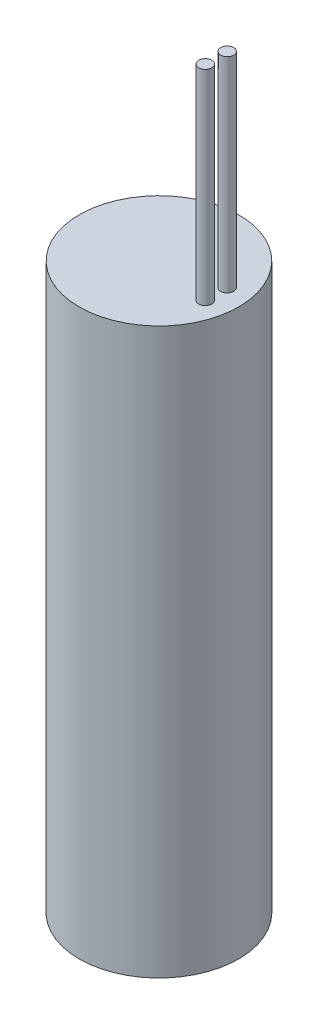
ISO-10303-21;
HEADER;
FILE_DESCRIPTION(('STEP AP214'),'2;1');
FILE_NAME('part.step','',(''),(''),'','','');
FILE_SCHEMA(('AUTOMOTIVE_DESIGN { 1 0 10303 214 1 1 1 1 }'));
ENDSEC;
DATA;
#1=APPLICATION_CONTEXT('core data for automotive mechanical design processes');
#2=APPLICATION_PROTOCOL_DEFINITION('international standard','automotive_design',2000,#1);
#3=PRODUCT_CONTEXT('',#1,'mechanical');
#4=PRODUCT('Part','Part','',(#3));
#5=PRODUCT_RELATED_PRODUCT_CATEGORY('part','',(#4));
#6=PRODUCT_DEFINITION_FORMATION('','',#4);
#7=PRODUCT_DEFINITION_CONTEXT('part definition',#1,'design');
#8=PRODUCT_DEFINITION('design','',#6,#7);
#9=PRODUCT_DEFINITION_SHAPE('','',#8);
#10=(LENGTH_UNIT() NAMED_UNIT(*) SI_UNIT(.MILLI.,.METRE.));
#11=(NAMED_UNIT(*) PLANE_ANGLE_UNIT() SI_UNIT($,.RADIAN.));
#12=(NAMED_UNIT(*) SI_UNIT($,.STERADIAN.) SOLID_ANGLE_UNIT());
#13=UNCERTAINTY_MEASURE_WITH_UNIT(LENGTH_MEASURE(1.E-05),#10,'distance_accuracy_value','');
#14=(GEOMETRIC_REPRESENTATION_CONTEXT(3) GLOBAL_UNCERTAINTY_ASSIGNED_CONTEXT((#13)) GLOBAL_UNIT_ASSIGNED_CONTEXT((#10,
#11,#12)) REPRESENTATION_CONTEXT('',''));
#15=CARTESIAN_POINT('',(0.,0.,0.));
#16=DIRECTION('',(0.,0.,1.));
#17=DIRECTION('',(1.,0.,0.));
#18=AXIS2_PLACEMENT_3D('',#15,#16,#17);
#19=CARTESIAN_POINT('',(0.,69.,0.));
#20=DIRECTION('',(0.,-1.,0.));
#21=DIRECTION('',(0.,0.,-1.));
#22=AXIS2_PLACEMENT_3D('',#19,#20,#21);
#23=CYLINDRICAL_SURFACE('',#22,9.75);
#24=CARTESIAN_POINT('',(0.,69.,0.));
#25=DIRECTION('',(0.,1.,0.));
#26=DIRECTION('',(0.,0.,1.));
#27=AXIS2_PLACEMENT_3D('',#24,#25,#26);
#28=CIRCLE('',#27,9.75);
#29=CARTESIAN_POINT('',(0.,69.,9.75));
#30=VERTEX_POINT('',#29);
#31=EDGE_CURVE('E10',#30,#30,#28,.T.);
#32=ORIENTED_EDGE('',*,*,#31,.F.);
#33=EDGE_LOOP('',(#32));
#34=FACE_BOUND('',#33,.T.);
#35=CARTESIAN_POINT('',(0.,0.,0.));
#36=DIRECTION('',(0.,1.,0.));
#37=DIRECTION('',(0.,0.,1.));
#38=AXIS2_PLACEMENT_3D('',#35,#36,#37);
#39=CIRCLE('',#38,9.75);
#40=CARTESIAN_POINT('',(0.,0.,9.75));
#41=VERTEX_POINT('',#40);
#42=EDGE_CURVE('E44',#41,#41,#39,.T.);
#43=ORIENTED_EDGE('',*,*,#42,.T.);
#44=EDGE_LOOP('',(#43));
#45=FACE_BOUND('',#44,.T.);
#46=ADVANCED_FACE('F41',(#34,#45),#23,.T.);
#47=CARTESIAN_POINT('',(0.,69.,0.));
#48=DIRECTION('',(0.,1.,0.));
#49=DIRECTION('',(0.,0.,1.));
#50=AXIS2_PLACEMENT_3D('',#47,#48,#49);
#51=PLANE('',#50);
#52=CARTESIAN_POINT('',(7.,69.,-1.33799721632115));
#53=DIRECTION('',(0.,1.,0.));
#54=DIRECTION('',(0.,0.,1.));
#55=AXIS2_PLACEMENT_3D('',#52,#53,#54);
#56=CIRCLE('',#55,0.800000000000001);
#57=CARTESIAN_POINT('',(7.,69.,-0.537997216321145));
#58=VERTEX_POINT('',#57);
#59=EDGE_CURVE('E59',#58,#58,#56,.T.);
#60=ORIENTED_EDGE('',*,*,#59,.F.);
#61=EDGE_LOOP('',(#60));
#62=FACE_BOUND('',#61,.T.);
#63=CARTESIAN_POINT('',(7.,69.,1.33799721632115));
#64=DIRECTION('',(0.,1.,0.));
#65=DIRECTION('',(0.,0.,1.));
#66=AXIS2_PLACEMENT_3D('',#63,#64,#65);
#67=CIRCLE('',#66,0.800000000000001);
#68=CARTESIAN_POINT('',(7.,69.,2.13799721632115));
#69=VERTEX_POINT('',#68);
#70=EDGE_CURVE('E56',#69,#69,#67,.T.);
#71=ORIENTED_EDGE('',*,*,#70,.F.);
#72=EDGE_LOOP('',(#71));
#73=FACE_BOUND('',#72,.T.);
#74=ORIENTED_EDGE('',*,*,#31,.T.);
#75=EDGE_LOOP('',(#74));
#76=FACE_BOUND('',#75,.T.);
#77=ADVANCED_FACE('F74',(#62,#73,#76),#51,.T.);
#78=CARTESIAN_POINT('',(0.,0.,0.));
#79=DIRECTION('',(0.,1.,0.));
#80=DIRECTION('',(0.,0.,1.));
#81=AXIS2_PLACEMENT_3D('',#78,#79,#80);
#82=PLANE('',#81);
#83=ORIENTED_EDGE('',*,*,#42,.F.);
#84=EDGE_LOOP('',(#83));
#85=FACE_BOUND('',#84,.T.);
#86=ADVANCED_FACE('F77',(#85),#82,.F.);
#87=CARTESIAN_POINT('',(7.,94.,1.33799721632115));
#88=DIRECTION('',(0.,-1.,0.));
#89=DIRECTION('',(0.,0.,-1.));
#90=AXIS2_PLACEMENT_3D('',#87,#88,#89);
#91=CYLINDRICAL_SURFACE('',#90,0.800000000000001);
#92=CARTESIAN_POINT('',(7.,94.,1.33799721632115));
#93=DIRECTION('',(0.,1.,0.));
#94=DIRECTION('',(0.,0.,1.));
#95=AXIS2_PLACEMENT_3D('',#92,#93,#94);
#96=CIRCLE('',#95,0.800000000000001);
#97=CARTESIAN_POINT('',(7.,94.,2.13799721632115));
#98=VERTEX_POINT('',#97);
#99=EDGE_CURVE('E53',#98,#98,#96,.T.);
#100=ORIENTED_EDGE('',*,*,#99,.F.);
#101=EDGE_LOOP('',(#100));
#102=FACE_BOUND('',#101,.T.);
#103=ORIENTED_EDGE('',*,*,#70,.T.);
#104=EDGE_LOOP('',(#103));
#105=FACE_BOUND('',#104,.T.);
#106=ADVANCED_FACE('F81',(#102,#105),#91,.T.);
#107=CARTESIAN_POINT('',(7.,94.,1.33799721632115));
#108=DIRECTION('',(0.,1.,0.));
#109=DIRECTION('',(0.,0.,1.));
#110=AXIS2_PLACEMENT_3D('',#107,#108,#109);
#111=PLANE('',#110);
#112=ORIENTED_EDGE('',*,*,#99,.T.);
#113=EDGE_LOOP('',(#112));
#114=FACE_BOUND('',#113,.T.);
#115=ADVANCED_FACE('F70',(#114),#111,.T.);
#116=CARTESIAN_POINT('',(7.,94.,-1.33799721632115));
#117=DIRECTION('',(0.,-1.,0.));
#118=DIRECTION('',(0.,0.,-1.));
#119=AXIS2_PLACEMENT_3D('',#116,#117,#118);
#120=CYLINDRICAL_SURFACE('',#119,0.800000000000001);
#121=CARTESIAN_POINT('',(7.,94.,-1.33799721632115));
#122=DIRECTION('',(0.,1.,0.));
#123=DIRECTION('',(0.,0.,1.));
#124=AXIS2_PLACEMENT_3D('',#121,#122,#123);
#125=CIRCLE('',#124,0.800000000000001);
#126=CARTESIAN_POINT('',(7.,94.,-0.537997216321145));
#127=VERTEX_POINT('',#126);
#128=EDGE_CURVE('E51',#127,#127,#125,.T.);
#129=ORIENTED_EDGE('',*,*,#128,.F.);
#130=EDGE_LOOP('',(#129));
#131=FACE_BOUND('',#130,.T.);
#132=ORIENTED_EDGE('',*,*,#59,.T.);
#133=EDGE_LOOP('',(#132));
#134=FACE_BOUND('',#133,.T.);
#135=ADVANCED_FACE('F67',(#131,#134),#120,.T.);
#136=CARTESIAN_POINT('',(7.,94.,-1.33799721632115));
#137=DIRECTION('',(0.,1.,0.));
#138=DIRECTION('',(0.,0.,1.));
#139=AXIS2_PLACEMENT_3D('',#136,#137,#138);
#140=PLANE('',#139);
#141=ORIENTED_EDGE('',*,*,#128,.T.);
#142=EDGE_LOOP('',(#141));
#143=FACE_BOUND('',#142,.T.);
#144=ADVANCED_FACE('F65',(#143),#140,.T.);
#145=CLOSED_SHELL('',(#46,#77,#86,#106,#115,#135,#144));
#146=MANIFOLD_SOLID_BREP('B2',#145);
#147=ADVANCED_BREP_SHAPE_REPRESENTATION('',(#18,#146),#14);
#148=SHAPE_DEFINITION_REPRESENTATION(#9,#147);
ENDSEC;
END-ISO-10303-21;
